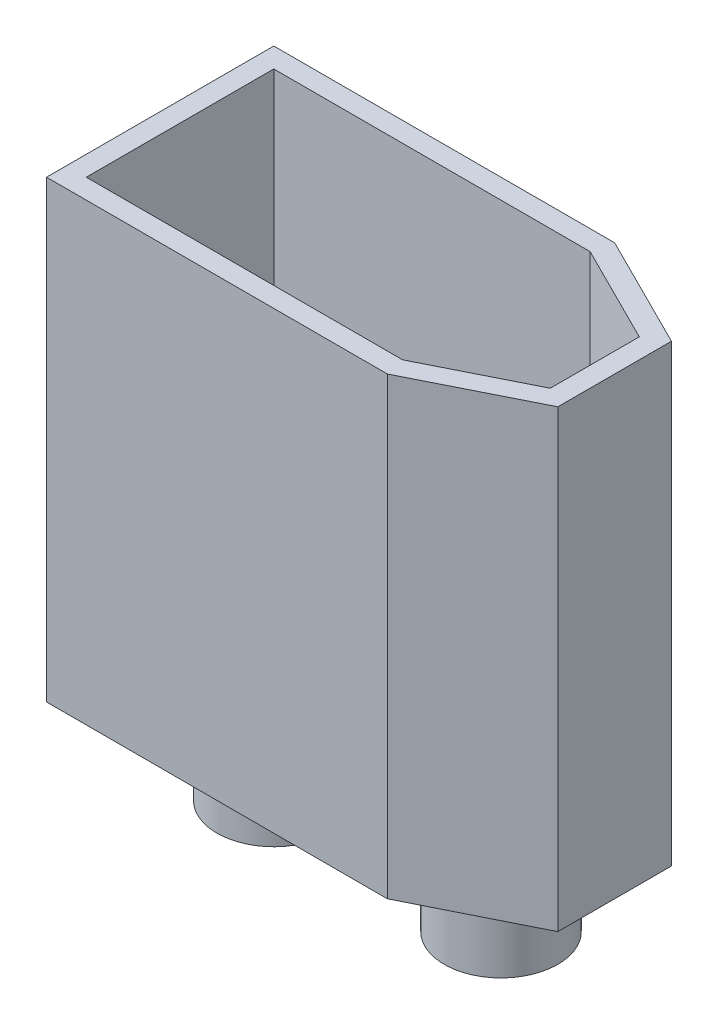
ISO-10303-21;
HEADER;
FILE_DESCRIPTION(('STEP AP214'),'2;1');
FILE_NAME('part.step','',(''),(''),'','','');
FILE_SCHEMA(('AUTOMOTIVE_DESIGN { 1 0 10303 214 1 1 1 1 }'));
ENDSEC;
DATA;
#1=APPLICATION_CONTEXT('core data for automotive mechanical design processes');
#2=APPLICATION_PROTOCOL_DEFINITION('international standard','automotive_design',2000,#1);
#3=PRODUCT_CONTEXT('',#1,'mechanical');
#4=PRODUCT('Part','Part','',(#3));
#5=PRODUCT_RELATED_PRODUCT_CATEGORY('part','',(#4));
#6=PRODUCT_DEFINITION_FORMATION('','',#4);
#7=PRODUCT_DEFINITION_CONTEXT('part definition',#1,'design');
#8=PRODUCT_DEFINITION('design','',#6,#7);
#9=PRODUCT_DEFINITION_SHAPE('','',#8);
#10=(LENGTH_UNIT() NAMED_UNIT(*) SI_UNIT(.MILLI.,.METRE.));
#11=(NAMED_UNIT(*) PLANE_ANGLE_UNIT() SI_UNIT($,.RADIAN.));
#12=(NAMED_UNIT(*) SI_UNIT($,.STERADIAN.) SOLID_ANGLE_UNIT());
#13=UNCERTAINTY_MEASURE_WITH_UNIT(LENGTH_MEASURE(1.E-05),#10,'distance_accuracy_value','');
#14=(GEOMETRIC_REPRESENTATION_CONTEXT(3) GLOBAL_UNCERTAINTY_ASSIGNED_CONTEXT((#13)) GLOBAL_UNIT_ASSIGNED_CONTEXT((#10,
#11,#12)) REPRESENTATION_CONTEXT('',''));
#15=CARTESIAN_POINT('',(0.,0.,0.));
#16=DIRECTION('',(0.,0.,1.));
#17=DIRECTION('',(1.,0.,0.));
#18=AXIS2_PLACEMENT_3D('',#15,#16,#17);
#19=CARTESIAN_POINT('',(12.,-3.,-4.));
#20=DIRECTION('',(0.,1.,0.));
#21=DIRECTION('',(0.,0.,1.));
#22=AXIS2_PLACEMENT_3D('',#19,#20,#21);
#23=CYLINDRICAL_SURFACE('',#22,2.);
#24=CARTESIAN_POINT('',(12.,-3.,-4.));
#25=DIRECTION('',(0.,-1.,0.));
#26=DIRECTION('',(0.,0.,-1.));
#27=AXIS2_PLACEMENT_3D('',#24,#25,#26);
#28=CIRCLE('',#27,2.);
#29=CARTESIAN_POINT('',(12.,-3.,-6.));
#30=VERTEX_POINT('',#29);
#31=EDGE_CURVE('E11',#30,#30,#28,.T.);
#32=ORIENTED_EDGE('',*,*,#31,.F.);
#33=EDGE_LOOP('',(#32));
#34=FACE_BOUND('',#33,.T.);
#35=CARTESIAN_POINT('',(12.,0.,-4.));
#36=DIRECTION('',(0.,-1.,0.));
#37=DIRECTION('',(0.,0.,-1.));
#38=AXIS2_PLACEMENT_3D('',#35,#36,#37);
#39=CIRCLE('',#38,2.);
#40=CARTESIAN_POINT('',(12.,0.,-6.));
#41=VERTEX_POINT('',#40);
#42=EDGE_CURVE('E42',#41,#41,#39,.T.);
#43=ORIENTED_EDGE('',*,*,#42,.T.);
#44=EDGE_LOOP('',(#43));
#45=FACE_BOUND('',#44,.T.);
#46=ADVANCED_FACE('F39',(#34,#45),#23,.T.);
#47=CARTESIAN_POINT('',(12.,-3.,-4.));
#48=DIRECTION('',(0.,-1.,0.));
#49=DIRECTION('',(0.,0.,-1.));
#50=AXIS2_PLACEMENT_3D('',#47,#48,#49);
#51=PLANE('',#50);
#52=ORIENTED_EDGE('',*,*,#31,.T.);
#53=EDGE_LOOP('',(#52));
#54=FACE_BOUND('',#53,.T.);
#55=ADVANCED_FACE('F54',(#54),#51,.T.);
#56=CARTESIAN_POINT('',(12.,0.,-4.));
#57=DIRECTION('',(0.,-1.,0.));
#58=DIRECTION('',(0.,0.,-1.));
#59=AXIS2_PLACEMENT_3D('',#56,#57,#58);
#60=PLANE('',#59);
#61=ORIENTED_EDGE('',*,*,#42,.F.);
#62=EDGE_LOOP('',(#61));
#63=FACE_BOUND('',#62,.T.);
#64=ADVANCED_FACE('F52',(#63),#60,.F.);
#65=CLOSED_SHELL('',(#46,#55,#64));
#66=MANIFOLD_SOLID_BREP('B2',#65);
#67=CARTESIAN_POINT('',(4.,-3.,-4.));
#68=DIRECTION('',(0.,1.,0.));
#69=DIRECTION('',(0.,0.,1.));
#70=AXIS2_PLACEMENT_3D('',#67,#68,#69);
#71=CYLINDRICAL_SURFACE('',#70,2.);
#72=CARTESIAN_POINT('',(4.,-3.,-4.));
#73=DIRECTION('',(0.,-1.,0.));
#74=DIRECTION('',(0.,0.,-1.));
#75=AXIS2_PLACEMENT_3D('',#72,#73,#74);
#76=CIRCLE('',#75,2.);
#77=CARTESIAN_POINT('',(4.,-3.,-6.));
#78=VERTEX_POINT('',#77);
#79=EDGE_CURVE('E38',#78,#78,#76,.T.);
#80=ORIENTED_EDGE('',*,*,#79,.F.);
#81=EDGE_LOOP('',(#80));
#82=FACE_BOUND('',#81,.T.);
#83=CARTESIAN_POINT('',(4.,0.,-4.));
#84=DIRECTION('',(0.,-1.,0.));
#85=DIRECTION('',(0.,0.,-1.));
#86=AXIS2_PLACEMENT_3D('',#83,#84,#85);
#87=CIRCLE('',#86,2.);
#88=CARTESIAN_POINT('',(4.,0.,-6.));
#89=VERTEX_POINT('',#88);
#90=EDGE_CURVE('E91',#89,#89,#87,.T.);
#91=ORIENTED_EDGE('',*,*,#90,.T.);
#92=EDGE_LOOP('',(#91));
#93=FACE_BOUND('',#92,.T.);
#94=ADVANCED_FACE('F88',(#82,#93),#71,.T.);
#95=CARTESIAN_POINT('',(4.,-3.,-4.));
#96=DIRECTION('',(0.,-1.,0.));
#97=DIRECTION('',(0.,0.,-1.));
#98=AXIS2_PLACEMENT_3D('',#95,#96,#97);
#99=PLANE('',#98);
#100=ORIENTED_EDGE('',*,*,#79,.T.);
#101=EDGE_LOOP('',(#100));
#102=FACE_BOUND('',#101,.T.);
#103=ADVANCED_FACE('F103',(#102),#99,.T.);
#104=CARTESIAN_POINT('',(4.,0.,-4.));
#105=DIRECTION('',(0.,-1.,0.));
#106=DIRECTION('',(0.,0.,-1.));
#107=AXIS2_PLACEMENT_3D('',#104,#105,#106);
#108=PLANE('',#107);
#109=ORIENTED_EDGE('',*,*,#90,.F.);
#110=EDGE_LOOP('',(#109));
#111=FACE_BOUND('',#110,.T.);
#112=ADVANCED_FACE('F101',(#111),#108,.F.);
#113=CLOSED_SHELL('',(#94,#103,#112));
#114=MANIFOLD_SOLID_BREP('B6',#113);
#115=CARTESIAN_POINT('',(16.,16.,-2.));
#116=DIRECTION('',(0.447213595499958,0.,0.894427190999916));
#117=DIRECTION('',(0.894427190999916,0.,-0.447213595499958));
#118=AXIS2_PLACEMENT_3D('',#115,#116,#117);
#119=PLANE('',#118);
#120=DIRECTION('',(-0.894427190999916,0.,0.447213595499958));
#121=VECTOR('',#120,1.);
#122=CARTESIAN_POINT('',(16.,0.,-2.));
#123=LINE('',#122,#121);
#124=CARTESIAN_POINT('',(16.,0.,-2.));
#125=VERTEX_POINT('',#124);
#126=CARTESIAN_POINT('',(12.,0.,0.));
#127=VERTEX_POINT('',#126);
#128=EDGE_CURVE('E226',#125,#127,#123,.T.);
#129=ORIENTED_EDGE('',*,*,#128,.F.);
#130=DIRECTION('',(0.,-1.,0.));
#131=VECTOR('',#130,1.);
#132=CARTESIAN_POINT('',(16.,16.,-2.));
#133=LINE('',#132,#131);
#134=CARTESIAN_POINT('',(16.,16.,-2.));
#135=VERTEX_POINT('',#134);
#136=EDGE_CURVE('E86',#135,#125,#133,.T.);
#137=ORIENTED_EDGE('',*,*,#136,.F.);
#138=DIRECTION('',(-0.894427190999916,0.,0.447213595499958));
#139=VECTOR('',#138,1.);
#140=CARTESIAN_POINT('',(16.,16.,-2.));
#141=LINE('',#140,#139);
#142=CARTESIAN_POINT('',(12.,16.,0.));
#143=VERTEX_POINT('',#142);
#144=EDGE_CURVE('E241',#135,#143,#141,.T.);
#145=ORIENTED_EDGE('',*,*,#144,.T.);
#146=DIRECTION('',(0.,-1.,0.));
#147=VECTOR('',#146,1.);
#148=CARTESIAN_POINT('',(12.,16.,0.));
#149=LINE('',#148,#147);
#150=EDGE_CURVE('E131',#143,#127,#149,.T.);
#151=ORIENTED_EDGE('',*,*,#150,.T.);
#152=EDGE_LOOP('',(#129,#137,#145,#151));
#153=FACE_BOUND('',#152,.T.);
#154=ADVANCED_FACE('F128',(#153),#119,.T.);
#155=CARTESIAN_POINT('',(16.,16.,-6.));
#156=DIRECTION('',(1.,0.,0.));
#157=DIRECTION('',(0.,0.,-1.));
#158=AXIS2_PLACEMENT_3D('',#155,#156,#157);
#159=PLANE('',#158);
#160=DIRECTION('',(0.,0.,1.));
#161=VECTOR('',#160,1.);
#162=CARTESIAN_POINT('',(16.,0.,-6.));
#163=LINE('',#162,#161);
#164=CARTESIAN_POINT('',(16.,0.,-6.));
#165=VERTEX_POINT('',#164);
#166=EDGE_CURVE('E239',#165,#125,#163,.T.);
#167=ORIENTED_EDGE('',*,*,#166,.F.);
#168=DIRECTION('',(0.,-1.,0.));
#169=VECTOR('',#168,1.);
#170=CARTESIAN_POINT('',(16.,16.,-6.));
#171=LINE('',#170,#169);
#172=CARTESIAN_POINT('',(16.,16.,-6.));
#173=VERTEX_POINT('',#172);
#174=EDGE_CURVE('E136',#173,#165,#171,.T.);
#175=ORIENTED_EDGE('',*,*,#174,.F.);
#176=DIRECTION('',(0.,0.,1.));
#177=VECTOR('',#176,1.);
#178=CARTESIAN_POINT('',(16.,16.,-6.));
#179=LINE('',#178,#177);
#180=EDGE_CURVE('E216',#173,#135,#179,.T.);
#181=ORIENTED_EDGE('',*,*,#180,.T.);
#182=ORIENTED_EDGE('',*,*,#136,.T.);
#183=EDGE_LOOP('',(#167,#175,#181,#182));
#184=FACE_BOUND('',#183,.T.);
#185=ADVANCED_FACE('F249',(#184),#159,.T.);
#186=CARTESIAN_POINT('',(12.,16.,-8.));
#187=DIRECTION('',(0.447213595499958,0.,-0.894427190999916));
#188=DIRECTION('',(-0.894427190999916,0.,-0.447213595499958));
#189=AXIS2_PLACEMENT_3D('',#186,#187,#188);
#190=PLANE('',#189);
#191=DIRECTION('',(0.894427190999916,0.,0.447213595499958));
#192=VECTOR('',#191,1.);
#193=CARTESIAN_POINT('',(12.,0.,-8.));
#194=LINE('',#193,#192);
#195=CARTESIAN_POINT('',(12.,0.,-8.));
#196=VERTEX_POINT('',#195);
#197=EDGE_CURVE('E203',#196,#165,#194,.T.);
#198=ORIENTED_EDGE('',*,*,#197,.F.);
#199=DIRECTION('',(0.,-1.,0.));
#200=VECTOR('',#199,1.);
#201=CARTESIAN_POINT('',(12.,16.,-8.));
#202=LINE('',#201,#200);
#203=CARTESIAN_POINT('',(12.,16.,-8.));
#204=VERTEX_POINT('',#203);
#205=EDGE_CURVE('E197',#204,#196,#202,.T.);
#206=ORIENTED_EDGE('',*,*,#205,.F.);
#207=DIRECTION('',(0.894427190999916,0.,0.447213595499958));
#208=VECTOR('',#207,1.);
#209=CARTESIAN_POINT('',(12.,16.,-8.));
#210=LINE('',#209,#208);
#211=EDGE_CURVE('E200',#204,#173,#210,.T.);
#212=ORIENTED_EDGE('',*,*,#211,.T.);
#213=ORIENTED_EDGE('',*,*,#174,.T.);
#214=EDGE_LOOP('',(#198,#206,#212,#213));
#215=FACE_BOUND('',#214,.T.);
#216=ADVANCED_FACE('F199',(#215),#190,.T.);
#217=CARTESIAN_POINT('',(0.,16.,-8.));
#218=DIRECTION('',(0.,0.,-1.));
#219=DIRECTION('',(-1.,0.,0.));
#220=AXIS2_PLACEMENT_3D('',#217,#218,#219);
#221=PLANE('',#220);
#222=DIRECTION('',(1.,0.,0.));
#223=VECTOR('',#222,1.);
#224=CARTESIAN_POINT('',(0.,0.,-8.));
#225=LINE('',#224,#223);
#226=CARTESIAN_POINT('',(0.,0.,-8.));
#227=VERTEX_POINT('',#226);
#228=EDGE_CURVE('E236',#227,#196,#225,.T.);
#229=ORIENTED_EDGE('',*,*,#228,.F.);
#230=DIRECTION('',(0.,-1.,0.));
#231=VECTOR('',#230,1.);
#232=CARTESIAN_POINT('',(0.,16.,-8.));
#233=LINE('',#232,#231);
#234=CARTESIAN_POINT('',(0.,16.,-8.));
#235=VERTEX_POINT('',#234);
#236=EDGE_CURVE('E208',#235,#227,#233,.T.);
#237=ORIENTED_EDGE('',*,*,#236,.F.);
#238=DIRECTION('',(1.,0.,0.));
#239=VECTOR('',#238,1.);
#240=CARTESIAN_POINT('',(0.,16.,-8.));
#241=LINE('',#240,#239);
#242=EDGE_CURVE('E214',#235,#204,#241,.T.);
#243=ORIENTED_EDGE('',*,*,#242,.T.);
#244=ORIENTED_EDGE('',*,*,#205,.T.);
#245=EDGE_LOOP('',(#229,#237,#243,#244));
#246=FACE_BOUND('',#245,.T.);
#247=ADVANCED_FACE('F218',(#246),#221,.T.);
#248=CARTESIAN_POINT('',(0.,16.,0.));
#249=DIRECTION('',(-1.,0.,0.));
#250=DIRECTION('',(0.,0.,1.));
#251=AXIS2_PLACEMENT_3D('',#248,#249,#250);
#252=PLANE('',#251);
#253=DIRECTION('',(0.,0.,-1.));
#254=VECTOR('',#253,1.);
#255=CARTESIAN_POINT('',(0.,0.,0.));
#256=LINE('',#255,#254);
#257=CARTESIAN_POINT('',(0.,0.,0.));
#258=VERTEX_POINT('',#257);
#259=EDGE_CURVE('E233',#258,#227,#256,.T.);
#260=ORIENTED_EDGE('',*,*,#259,.F.);
#261=DIRECTION('',(0.,-1.,0.));
#262=VECTOR('',#261,1.);
#263=CARTESIAN_POINT('',(0.,16.,0.));
#264=LINE('',#263,#262);
#265=CARTESIAN_POINT('',(0.,16.,0.));
#266=VERTEX_POINT('',#265);
#267=EDGE_CURVE('E244',#266,#258,#264,.T.);
#268=ORIENTED_EDGE('',*,*,#267,.F.);
#269=DIRECTION('',(0.,0.,-1.));
#270=VECTOR('',#269,1.);
#271=CARTESIAN_POINT('',(0.,16.,0.));
#272=LINE('',#271,#270);
#273=EDGE_CURVE('E219',#266,#235,#272,.T.);
#274=ORIENTED_EDGE('',*,*,#273,.T.);
#275=ORIENTED_EDGE('',*,*,#236,.T.);
#276=EDGE_LOOP('',(#260,#268,#274,#275));
#277=FACE_BOUND('',#276,.T.);
#278=ADVANCED_FACE('F262',(#277),#252,.T.);
#279=CARTESIAN_POINT('',(12.,16.,0.));
#280=DIRECTION('',(0.,0.,1.));
#281=DIRECTION('',(1.,0.,0.));
#282=AXIS2_PLACEMENT_3D('',#279,#280,#281);
#283=PLANE('',#282);
#284=DIRECTION('',(-1.,0.,0.));
#285=VECTOR('',#284,1.);
#286=CARTESIAN_POINT('',(12.,0.,0.));
#287=LINE('',#286,#285);
#288=EDGE_CURVE('E229',#127,#258,#287,.T.);
#289=ORIENTED_EDGE('',*,*,#288,.F.);
#290=ORIENTED_EDGE('',*,*,#150,.F.);
#291=DIRECTION('',(-1.,0.,0.));
#292=VECTOR('',#291,1.);
#293=CARTESIAN_POINT('',(12.,16.,0.));
#294=LINE('',#293,#292);
#295=EDGE_CURVE('E221',#143,#266,#294,.T.);
#296=ORIENTED_EDGE('',*,*,#295,.T.);
#297=ORIENTED_EDGE('',*,*,#267,.T.);
#298=EDGE_LOOP('',(#289,#290,#296,#297));
#299=FACE_BOUND('',#298,.T.);
#300=ADVANCED_FACE('F246',(#299),#283,.T.);
#301=CARTESIAN_POINT('',(0.,16.,0.));
#302=DIRECTION('',(0.,-1.,0.));
#303=DIRECTION('',(0.,0.,-1.));
#304=AXIS2_PLACEMENT_3D('',#301,#302,#303);
#305=PLANE('',#304);
#306=DIRECTION('',(0.894427190999916,0.,-0.447213595499958));
#307=VECTOR('',#306,1.);
#308=CARTESIAN_POINT('',(11.8347524157501,16.,-0.7));
#309=LINE('',#308,#307);
#310=CARTESIAN_POINT('',(11.8347524157501,16.,-0.7));
#311=VERTEX_POINT('',#310);
#312=CARTESIAN_POINT('',(15.3,16.,-2.43262379212493));
#313=VERTEX_POINT('',#312);
#314=EDGE_CURVE('E334',#311,#313,#309,.T.);
#315=ORIENTED_EDGE('',*,*,#314,.F.);
#316=DIRECTION('',(1.,0.,0.));
#317=VECTOR('',#316,1.);
#318=CARTESIAN_POINT('',(0.7,16.,-0.7));
#319=LINE('',#318,#317);
#320=CARTESIAN_POINT('',(0.7,16.,-0.7));
#321=VERTEX_POINT('',#320);
#322=EDGE_CURVE('E144',#321,#311,#319,.T.);
#323=ORIENTED_EDGE('',*,*,#322,.F.);
#324=DIRECTION('',(0.,0.,1.));
#325=VECTOR('',#324,1.);
#326=CARTESIAN_POINT('',(0.7,16.,-7.3));
#327=LINE('',#326,#325);
#328=CARTESIAN_POINT('',(0.7,16.,-7.3));
#329=VERTEX_POINT('',#328);
#330=EDGE_CURVE('E317',#329,#321,#327,.T.);
#331=ORIENTED_EDGE('',*,*,#330,.F.);
#332=DIRECTION('',(-1.,0.,0.));
#333=VECTOR('',#332,1.);
#334=CARTESIAN_POINT('',(11.8347524157501,16.,-7.3));
#335=LINE('',#334,#333);
#336=CARTESIAN_POINT('',(11.8347524157501,16.,-7.3));
#337=VERTEX_POINT('',#336);
#338=EDGE_CURVE('E322',#337,#329,#335,.T.);
#339=ORIENTED_EDGE('',*,*,#338,.F.);
#340=DIRECTION('',(-0.894427190999916,0.,-0.447213595499958));
#341=VECTOR('',#340,1.);
#342=CARTESIAN_POINT('',(15.3,16.,-5.56737620787507));
#343=LINE('',#342,#341);
#344=CARTESIAN_POINT('',(15.3,16.,-5.56737620787507));
#345=VERTEX_POINT('',#344);
#346=EDGE_CURVE('E340',#345,#337,#343,.T.);
#347=ORIENTED_EDGE('',*,*,#346,.F.);
#348=DIRECTION('',(0.,0.,-1.));
#349=VECTOR('',#348,1.);
#350=CARTESIAN_POINT('',(15.3,16.,-2.43262379212493));
#351=LINE('',#350,#349);
#352=EDGE_CURVE('E337',#313,#345,#351,.T.);
#353=ORIENTED_EDGE('',*,*,#352,.F.);
#354=EDGE_LOOP('',(#315,#323,#331,#339,#347,#353));
#355=FACE_BOUND('',#354,.T.);
#356=ORIENTED_EDGE('',*,*,#144,.F.);
#357=ORIENTED_EDGE('',*,*,#180,.F.);
#358=ORIENTED_EDGE('',*,*,#211,.F.);
#359=ORIENTED_EDGE('',*,*,#242,.F.);
#360=ORIENTED_EDGE('',*,*,#273,.F.);
#361=ORIENTED_EDGE('',*,*,#295,.F.);
#362=EDGE_LOOP('',(#356,#357,#358,#359,#360,#361));
#363=FACE_BOUND('',#362,.T.);
#364=ADVANCED_FACE('F212',(#355,#363),#305,.F.);
#365=CARTESIAN_POINT('',(0.,0.,0.));
#366=DIRECTION('',(0.,-1.,0.));
#367=DIRECTION('',(0.,0.,-1.));
#368=AXIS2_PLACEMENT_3D('',#365,#366,#367);
#369=PLANE('',#368);
#370=ORIENTED_EDGE('',*,*,#128,.T.);
#371=ORIENTED_EDGE('',*,*,#288,.T.);
#372=ORIENTED_EDGE('',*,*,#259,.T.);
#373=ORIENTED_EDGE('',*,*,#228,.T.);
#374=ORIENTED_EDGE('',*,*,#197,.T.);
#375=ORIENTED_EDGE('',*,*,#166,.T.);
#376=EDGE_LOOP('',(#370,#371,#372,#373,#374,#375));
#377=FACE_BOUND('',#376,.T.);
#378=ADVANCED_FACE('F248',(#377),#369,.T.);
#379=CARTESIAN_POINT('',(0.7,1.,-0.7));
#380=DIRECTION('',(0.,0.,1.));
#381=DIRECTION('',(1.,0.,0.));
#382=AXIS2_PLACEMENT_3D('',#379,#380,#381);
#383=PLANE('',#382);
#384=ORIENTED_EDGE('',*,*,#322,.T.);
#385=DIRECTION('',(0.,1.,0.));
#386=VECTOR('',#385,1.);
#387=CARTESIAN_POINT('',(11.8347524157501,1.,-0.7));
#388=LINE('',#387,#386);
#389=CARTESIAN_POINT('',(11.8347524157501,1.,-0.7));
#390=VERTEX_POINT('',#389);
#391=EDGE_CURVE('E332',#390,#311,#388,.T.);
#392=ORIENTED_EDGE('',*,*,#391,.F.);
#393=DIRECTION('',(1.,0.,0.));
#394=VECTOR('',#393,1.);
#395=CARTESIAN_POINT('',(0.7,1.,-0.7));
#396=LINE('',#395,#394);
#397=CARTESIAN_POINT('',(0.7,1.,-0.7));
#398=VERTEX_POINT('',#397);
#399=EDGE_CURVE('E308',#398,#390,#396,.T.);
#400=ORIENTED_EDGE('',*,*,#399,.F.);
#401=DIRECTION('',(0.,1.,0.));
#402=VECTOR('',#401,1.);
#403=CARTESIAN_POINT('',(0.7,1.,-0.7));
#404=LINE('',#403,#402);
#405=EDGE_CURVE('E230',#398,#321,#404,.T.);
#406=ORIENTED_EDGE('',*,*,#405,.T.);
#407=EDGE_LOOP('',(#384,#392,#400,#406));
#408=FACE_BOUND('',#407,.T.);
#409=ADVANCED_FACE('F273',(#408),#383,.F.);
#410=CARTESIAN_POINT('',(0.7,1.,-7.3));
#411=DIRECTION('',(-1.,0.,0.));
#412=DIRECTION('',(0.,0.,1.));
#413=AXIS2_PLACEMENT_3D('',#410,#411,#412);
#414=PLANE('',#413);
#415=ORIENTED_EDGE('',*,*,#330,.T.);
#416=ORIENTED_EDGE('',*,*,#405,.F.);
#417=DIRECTION('',(0.,0.,1.));
#418=VECTOR('',#417,1.);
#419=CARTESIAN_POINT('',(0.7,1.,-7.3));
#420=LINE('',#419,#418);
#421=CARTESIAN_POINT('',(0.7,1.,-7.3));
#422=VERTEX_POINT('',#421);
#423=EDGE_CURVE('E315',#422,#398,#420,.T.);
#424=ORIENTED_EDGE('',*,*,#423,.F.);
#425=DIRECTION('',(0.,1.,0.));
#426=VECTOR('',#425,1.);
#427=CARTESIAN_POINT('',(0.7,1.,-7.3));
#428=LINE('',#427,#426);
#429=EDGE_CURVE('E346',#422,#329,#428,.T.);
#430=ORIENTED_EDGE('',*,*,#429,.T.);
#431=EDGE_LOOP('',(#415,#416,#424,#430));
#432=FACE_BOUND('',#431,.T.);
#433=ADVANCED_FACE('F278',(#432),#414,.F.);
#434=CARTESIAN_POINT('',(11.8347524157501,1.,-7.3));
#435=DIRECTION('',(0.,0.,-1.));
#436=DIRECTION('',(-1.,0.,0.));
#437=AXIS2_PLACEMENT_3D('',#434,#435,#436);
#438=PLANE('',#437);
#439=ORIENTED_EDGE('',*,*,#338,.T.);
#440=ORIENTED_EDGE('',*,*,#429,.F.);
#441=DIRECTION('',(-1.,0.,0.));
#442=VECTOR('',#441,1.);
#443=CARTESIAN_POINT('',(11.8347524157501,1.,-7.3));
#444=LINE('',#443,#442);
#445=CARTESIAN_POINT('',(11.8347524157501,1.,-7.3));
#446=VERTEX_POINT('',#445);
#447=EDGE_CURVE('E329',#446,#422,#444,.T.);
#448=ORIENTED_EDGE('',*,*,#447,.F.);
#449=DIRECTION('',(0.,1.,0.));
#450=VECTOR('',#449,1.);
#451=CARTESIAN_POINT('',(11.8347524157501,1.,-7.3));
#452=LINE('',#451,#450);
#453=EDGE_CURVE('E349',#446,#337,#452,.T.);
#454=ORIENTED_EDGE('',*,*,#453,.T.);
#455=EDGE_LOOP('',(#439,#440,#448,#454));
#456=FACE_BOUND('',#455,.T.);
#457=ADVANCED_FACE('F291',(#456),#438,.F.);
#458=CARTESIAN_POINT('',(15.3,1.,-5.56737620787507));
#459=DIRECTION('',(0.447213595499958,0.,-0.894427190999916));
#460=DIRECTION('',(-0.894427190999916,0.,-0.447213595499958));
#461=AXIS2_PLACEMENT_3D('',#458,#459,#460);
#462=PLANE('',#461);
#463=ORIENTED_EDGE('',*,*,#346,.T.);
#464=ORIENTED_EDGE('',*,*,#453,.F.);
#465=DIRECTION('',(-0.894427190999916,0.,-0.447213595499958));
#466=VECTOR('',#465,1.);
#467=CARTESIAN_POINT('',(15.3,1.,-5.56737620787507));
#468=LINE('',#467,#466);
#469=CARTESIAN_POINT('',(15.3,1.,-5.56737620787507));
#470=VERTEX_POINT('',#469);
#471=EDGE_CURVE('E326',#470,#446,#468,.T.);
#472=ORIENTED_EDGE('',*,*,#471,.F.);
#473=DIRECTION('',(0.,1.,0.));
#474=VECTOR('',#473,1.);
#475=CARTESIAN_POINT('',(15.3,1.,-5.56737620787507));
#476=LINE('',#475,#474);
#477=EDGE_CURVE('E352',#470,#345,#476,.T.);
#478=ORIENTED_EDGE('',*,*,#477,.T.);
#479=EDGE_LOOP('',(#463,#464,#472,#478));
#480=FACE_BOUND('',#479,.T.);
#481=ADVANCED_FACE('F287',(#480),#462,.F.);
#482=CARTESIAN_POINT('',(15.3,1.,-2.43262379212493));
#483=DIRECTION('',(1.,0.,0.));
#484=DIRECTION('',(0.,0.,-1.));
#485=AXIS2_PLACEMENT_3D('',#482,#483,#484);
#486=PLANE('',#485);
#487=ORIENTED_EDGE('',*,*,#352,.T.);
#488=ORIENTED_EDGE('',*,*,#477,.F.);
#489=DIRECTION('',(0.,0.,-1.));
#490=VECTOR('',#489,1.);
#491=CARTESIAN_POINT('',(15.3,1.,-2.43262379212493));
#492=LINE('',#491,#490);
#493=CARTESIAN_POINT('',(15.3,1.,-2.43262379212493));
#494=VERTEX_POINT('',#493);
#495=EDGE_CURVE('E319',#494,#470,#492,.T.);
#496=ORIENTED_EDGE('',*,*,#495,.F.);
#497=DIRECTION('',(0.,1.,0.));
#498=VECTOR('',#497,1.);
#499=CARTESIAN_POINT('',(15.3,1.,-2.43262379212493));
#500=LINE('',#499,#498);
#501=EDGE_CURVE('E355',#494,#313,#500,.T.);
#502=ORIENTED_EDGE('',*,*,#501,.T.);
#503=EDGE_LOOP('',(#487,#488,#496,#502));
#504=FACE_BOUND('',#503,.T.);
#505=ADVANCED_FACE('F283',(#504),#486,.F.);
#506=CARTESIAN_POINT('',(11.8347524157501,1.,-0.7));
#507=DIRECTION('',(0.447213595499958,0.,0.894427190999916));
#508=DIRECTION('',(0.894427190999916,0.,-0.447213595499958));
#509=AXIS2_PLACEMENT_3D('',#506,#507,#508);
#510=PLANE('',#509);
#511=ORIENTED_EDGE('',*,*,#314,.T.);
#512=ORIENTED_EDGE('',*,*,#501,.F.);
#513=DIRECTION('',(0.894427190999916,0.,-0.447213595499958));
#514=VECTOR('',#513,1.);
#515=CARTESIAN_POINT('',(11.8347524157501,1.,-0.7));
#516=LINE('',#515,#514);
#517=EDGE_CURVE('E312',#390,#494,#516,.T.);
#518=ORIENTED_EDGE('',*,*,#517,.F.);
#519=ORIENTED_EDGE('',*,*,#391,.T.);
#520=EDGE_LOOP('',(#511,#512,#518,#519));
#521=FACE_BOUND('',#520,.T.);
#522=ADVANCED_FACE('F279',(#521),#510,.F.);
#523=CARTESIAN_POINT('',(0.,1.,0.));
#524=DIRECTION('',(0.,1.,0.));
#525=DIRECTION('',(0.,0.,1.));
#526=AXIS2_PLACEMENT_3D('',#523,#524,#525);
#527=PLANE('',#526);
#528=ORIENTED_EDGE('',*,*,#399,.T.);
#529=ORIENTED_EDGE('',*,*,#517,.T.);
#530=ORIENTED_EDGE('',*,*,#495,.T.);
#531=ORIENTED_EDGE('',*,*,#471,.T.);
#532=ORIENTED_EDGE('',*,*,#447,.T.);
#533=ORIENTED_EDGE('',*,*,#423,.T.);
#534=EDGE_LOOP('',(#528,#529,#530,#531,#532,#533));
#535=FACE_BOUND('',#534,.T.);
#536=ADVANCED_FACE('F282',(#535),#527,.T.);
#537=CLOSED_SHELL('',(#154,#185,#216,#247,#278,#300,#364,#378,#409,#433,#457,#481,#505,#522,#536));
#538=MANIFOLD_SOLID_BREP('B33',#537);
#539=ADVANCED_BREP_SHAPE_REPRESENTATION('',(#18,#66,#114,#538),#14);
#540=SHAPE_DEFINITION_REPRESENTATION(#9,#539);
ENDSEC;
END-ISO-10303-21;
